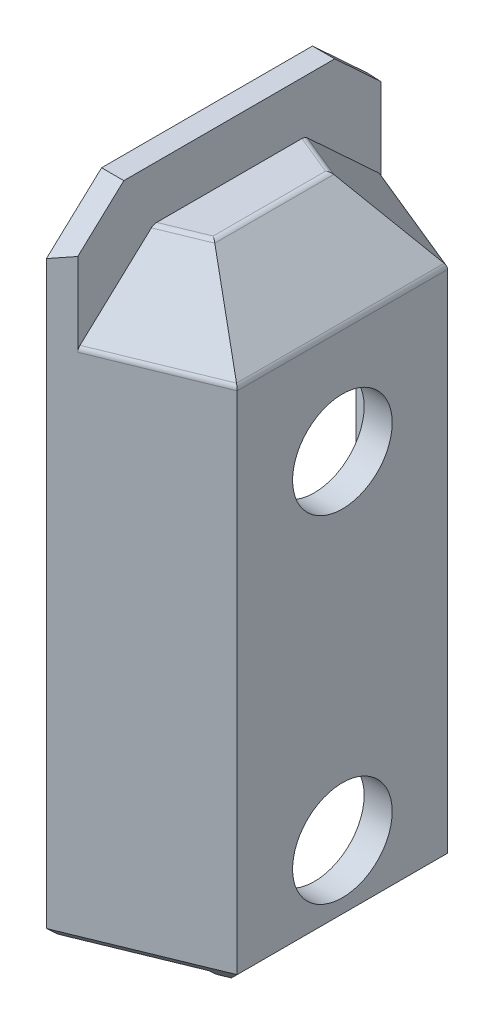
ISO-10303-21;
HEADER;
FILE_DESCRIPTION(('STEP AP214'),'2;1');
FILE_NAME('part.step','',(''),(''),'','','');
FILE_SCHEMA(('AUTOMOTIVE_DESIGN { 1 0 10303 214 1 1 1 1 }'));
ENDSEC;
DATA;
#1=APPLICATION_CONTEXT('core data for automotive mechanical design processes');
#2=APPLICATION_PROTOCOL_DEFINITION('international standard','automotive_design',2000,#1);
#3=PRODUCT_CONTEXT('',#1,'mechanical');
#4=PRODUCT('Part','Part','',(#3));
#5=PRODUCT_RELATED_PRODUCT_CATEGORY('part','',(#4));
#6=PRODUCT_DEFINITION_FORMATION('','',#4);
#7=PRODUCT_DEFINITION_CONTEXT('part definition',#1,'design');
#8=PRODUCT_DEFINITION('design','',#6,#7);
#9=PRODUCT_DEFINITION_SHAPE('','',#8);
#10=(LENGTH_UNIT() NAMED_UNIT(*) SI_UNIT(.MILLI.,.METRE.));
#11=(NAMED_UNIT(*) PLANE_ANGLE_UNIT() SI_UNIT($,.RADIAN.));
#12=(NAMED_UNIT(*) SI_UNIT($,.STERADIAN.) SOLID_ANGLE_UNIT());
#13=UNCERTAINTY_MEASURE_WITH_UNIT(LENGTH_MEASURE(1.E-05),#10,'distance_accuracy_value','');
#14=(GEOMETRIC_REPRESENTATION_CONTEXT(3) GLOBAL_UNCERTAINTY_ASSIGNED_CONTEXT((#13)) GLOBAL_UNIT_ASSIGNED_CONTEXT((#10,
#11,#12)) REPRESENTATION_CONTEXT('',''));
#15=CARTESIAN_POINT('',(0.,0.,0.));
#16=DIRECTION('',(0.,0.,1.));
#17=DIRECTION('',(1.,0.,0.));
#18=AXIS2_PLACEMENT_3D('',#15,#16,#17);
#19=CARTESIAN_POINT('',(3.175,7.5,-19.402609778092));
#20=DIRECTION('',(0.,1.,0.));
#21=DIRECTION('',(0.,0.,1.));
#22=AXIS2_PLACEMENT_3D('',#19,#20,#21);
#23=PLANE('',#22);
#24=DIRECTION('',(0.,0.,1.));
#25=VECTOR('',#24,1.);
#26=CARTESIAN_POINT('',(8.88578643762691,7.5,-19.402609778092));
#27=LINE('',#26,#25);
#28=CARTESIAN_POINT('',(8.88578643762691,7.5,8.01080265694155));
#29=VERTEX_POINT('',#28);
#30=CARTESIAN_POINT('',(8.88578643762691,7.5,-8.01080265694154));
#31=VERTEX_POINT('',#30);
#32=EDGE_CURVE('E309',#29,#31,#27,.F.);
#33=ORIENTED_EDGE('',*,*,#32,.T.);
#34=DIRECTION('',(0.925426676120117,0.,0.378926730549948));
#35=VECTOR('',#34,1.);
#36=CARTESIAN_POINT('',(0.000233412048950173,7.5,-11.6490958291533));
#37=LINE('',#36,#35);
#38=CARTESIAN_POINT('',(3.175,7.5,-10.3491506746921));
#39=VERTEX_POINT('',#38);
#40=EDGE_CURVE('E311',#31,#39,#37,.F.);
#41=ORIENTED_EDGE('',*,*,#40,.T.);
#42=DIRECTION('',(0.,0.,1.));
#43=VECTOR('',#42,1.);
#44=CARTESIAN_POINT('',(3.175,7.5,-19.402609778092));
#45=LINE('',#44,#43);
#46=CARTESIAN_POINT('',(3.175,7.5,10.3491506746921));
#47=VERTEX_POINT('',#46);
#48=EDGE_CURVE('E232',#39,#47,#45,.T.);
#49=ORIENTED_EDGE('',*,*,#48,.T.);
#50=DIRECTION('',(0.925426676120117,0.,-0.378926730549948));
#51=VECTOR('',#50,1.);
#52=CARTESIAN_POINT('',(13.6080172522402,7.5,6.07723025227988));
#53=LINE('',#52,#51);
#54=EDGE_CURVE('E307',#47,#29,#53,.T.);
#55=ORIENTED_EDGE('',*,*,#54,.T.);
#56=EDGE_LOOP('',(#33,#41,#49,#55));
#57=FACE_BOUND('',#56,.T.);
#58=ADVANCED_FACE('F41',(#57),#23,.T.);
#59=CARTESIAN_POINT('',(0.,-2.50000000000004,22.902609778092));
#60=DIRECTION('',(0.267941660744716,0.707106781186546,0.654375478175463));
#61=DIRECTION('',(0.925426676120117,0.,-0.378926730549948));
#62=AXIS2_PLACEMENT_3D('',#59,#60,#61);
#63=PLANE('',#62);
#64=DIRECTION('',(0.,-0.679210724111777,0.733943316783766));
#65=VECTOR('',#64,1.);
#66=CARTESIAN_POINT('',(3.175,-3.14807312601304,22.302865619203));
#67=LINE('',#66,#65);
#68=CARTESIAN_POINT('',(3.175,7.20710678118655,11.1132379864509));
#69=VERTEX_POINT('',#68);
#70=CARTESIAN_POINT('',(3.175,-2.20710678118658,21.2860737229812));
#71=VERTEX_POINT('',#70);
#72=EDGE_CURVE('E237',#69,#71,#67,.T.);
#73=ORIENTED_EDGE('',*,*,#72,.T.);
#74=DIRECTION('',(-0.925426676120117,0.,0.378926730549948));
#75=VECTOR('',#74,1.);
#76=CARTESIAN_POINT('',(19.1890149301948,-2.20710678118658,14.7289488020553));
#77=LINE('',#76,#75);
#78=CARTESIAN_POINT('',(19.0071067811865,-2.20710678118657,14.8034332122661));
#79=VERTEX_POINT('',#78);
#80=EDGE_CURVE('E343',#71,#79,#77,.F.);
#81=ORIENTED_EDGE('',*,*,#80,.T.);
#82=DIRECTION('',(-0.638823976736833,0.638823976736836,-0.428728181360023));
#83=VECTOR('',#82,1.);
#84=CARTESIAN_POINT('',(1.71582840770105,15.084171592299,3.19889330704541));
#85=LINE('',#84,#83);
#86=CARTESIAN_POINT('',(9.59289321881345,7.20710678118655,8.48535686180093));
#87=VERTEX_POINT('',#86);
#88=EDGE_CURVE('E295',#87,#79,#85,.F.);
#89=ORIENTED_EDGE('',*,*,#88,.F.);
#90=DIRECTION('',(0.925426676120117,0.,-0.378926730549948));
#91=VECTOR('',#90,1.);
#92=CARTESIAN_POINT('',(-3.67828223569425,7.20710678118655,13.9193942148355));
#93=LINE('',#92,#91);
#94=EDGE_CURVE('E318',#87,#69,#93,.F.);
#95=ORIENTED_EDGE('',*,*,#94,.T.);
#96=EDGE_LOOP('',(#73,#81,#89,#95));
#97=FACE_BOUND('',#96,.T.);
#98=ADVANCED_FACE('F431',(#97),#63,.T.);
#99=CARTESIAN_POINT('',(0.157190002988433,7.5,-12.0324201093841));
#100=DIRECTION('',(-0.267941660744716,-0.707106781186546,0.654375478175462));
#101=DIRECTION('',(-0.925426676120117,0.,-0.378926730549948));
#102=AXIS2_PLACEMENT_3D('',#99,#100,#101);
#103=PLANE('',#102);
#104=DIRECTION('',(-0.638823976736833,0.638823976736836,0.428728181360024));
#105=VECTOR('',#104,1.);
#106=CARTESIAN_POINT('',(12.3438734094776,4.45612659052238,-10.331597417964));
#107=LINE('',#106,#105);
#108=CARTESIAN_POINT('',(9.59289321881346,7.20710678118655,-8.48535686180092));
#109=VERTEX_POINT('',#108);
#110=CARTESIAN_POINT('',(19.0071067811866,-2.20710678118658,-14.8034332122661));
#111=VERTEX_POINT('',#110);
#112=EDGE_CURVE('E240',#109,#111,#107,.F.);
#113=ORIENTED_EDGE('',*,*,#112,.T.);
#114=DIRECTION('',(0.925426676120117,0.,0.378926730549948));
#115=VECTOR('',#114,1.);
#116=CARTESIAN_POINT('',(3.83547223868268,-2.20710678118659,-21.0156356726406));
#117=LINE('',#116,#115);
#118=CARTESIAN_POINT('',(3.175,-2.20710678118658,-21.2860737229812));
#119=VERTEX_POINT('',#118);
#120=EDGE_CURVE('E334',#111,#119,#117,.F.);
#121=ORIENTED_EDGE('',*,*,#120,.T.);
#122=DIRECTION('',(0.,-0.679210724111777,-0.733943316783766));
#123=VECTOR('',#122,1.);
#124=CARTESIAN_POINT('',(3.175,6.88401210756644,-11.4623684815591));
#125=LINE('',#124,#123);
#126=CARTESIAN_POINT('',(3.175,7.20710678118655,-11.1132379864509));
#127=VERTEX_POINT('',#126);
#128=EDGE_CURVE('E291',#119,#127,#125,.F.);
#129=ORIENTED_EDGE('',*,*,#128,.T.);
#130=DIRECTION('',(-0.925426676120117,0.,-0.378926730549948));
#131=VECTOR('',#130,1.);
#132=CARTESIAN_POINT('',(0.268175072793666,7.20710678118655,-12.3034713073288));
#133=LINE('',#132,#131);
#134=EDGE_CURVE('E314',#127,#109,#133,.F.);
#135=ORIENTED_EDGE('',*,*,#134,.T.);
#136=EDGE_LOOP('',(#113,#121,#129,#135));
#137=FACE_BOUND('',#136,.T.);
#138=ADVANCED_FACE('F439',(#137),#103,.F.);
#139=CARTESIAN_POINT('',(19.3,-2.5,15.));
#140=DIRECTION('',(0.,1.,0.));
#141=DIRECTION('',(0.,0.,1.));
#142=AXIS2_PLACEMENT_3D('',#139,#140,#141);
#143=PLANE('',#142);
#144=DIRECTION('',(0.925426676120117,0.,0.378926730549948));
#145=VECTOR('',#144,1.);
#146=CARTESIAN_POINT('',(13.4053663472503,-2.5,-10.3728666193994));
#147=LINE('',#146,#145);
#148=CARTESIAN_POINT('',(0.,-2.5,-15.8618499963261));
#149=VERTEX_POINT('',#148);
#150=CARTESIAN_POINT('',(10.3,-2.5,-11.6443950370335));
#151=VERTEX_POINT('',#150);
#152=EDGE_CURVE('E276',#149,#151,#147,.T.);
#153=ORIENTED_EDGE('',*,*,#152,.T.);
#154=DIRECTION('',(0.,0.,1.));
#155=VECTOR('',#154,1.);
#156=CARTESIAN_POINT('',(10.3,-2.5,15.));
#157=LINE('',#156,#155);
#158=CARTESIAN_POINT('',(10.3,-2.5,11.6443950370335));
#159=VERTEX_POINT('',#158);
#160=EDGE_CURVE('E274',#151,#159,#157,.T.);
#161=ORIENTED_EDGE('',*,*,#160,.T.);
#162=DIRECTION('',(-0.925426676120117,0.,0.378926730549948));
#163=VECTOR('',#162,1.);
#164=CARTESIAN_POINT('',(-1.89463365274974,-2.5,16.6376298113584));
#165=LINE('',#164,#163);
#166=CARTESIAN_POINT('',(0.,-2.5,15.8618499963261));
#167=VERTEX_POINT('',#166);
#168=EDGE_CURVE('E278',#159,#167,#165,.T.);
#169=ORIENTED_EDGE('',*,*,#168,.T.);
#170=DIRECTION('',(0.,0.,-1.));
#171=VECTOR('',#170,1.);
#172=CARTESIAN_POINT('',(0.,-2.5,15.));
#173=LINE('',#172,#171);
#174=EDGE_CURVE('E264',#167,#149,#173,.T.);
#175=ORIENTED_EDGE('',*,*,#174,.T.);
#176=EDGE_LOOP('',(#153,#161,#169,#175));
#177=FACE_BOUND('',#176,.T.);
#178=ADVANCED_FACE('F406',(#177),#143,.F.);
#179=CARTESIAN_POINT('',(19.3,0.,0.));
#180=DIRECTION('',(1.,0.,0.));
#181=DIRECTION('',(0.,0.,-1.));
#182=AXIS2_PLACEMENT_3D('',#179,#180,#181);
#183=PLANE('',#182);
#184=CARTESIAN_POINT('',(19.3,-17.9000000000868,-2.03531101694576E-06));
#185=DIRECTION('',(1.,0.,0.));
#186=DIRECTION('',(0.,0.,-1.));
#187=AXIS2_PLACEMENT_3D('',#184,#185,#186);
#188=CIRCLE('',#187,7.1);
#189=CARTESIAN_POINT('',(19.3,-17.9000000000868,-7.10000203531102));
#190=VERTEX_POINT('',#189);
#191=EDGE_CURVE('E247',#190,#190,#188,.T.);
#192=ORIENTED_EDGE('',*,*,#191,.F.);
#193=EDGE_LOOP('',(#192));
#194=FACE_BOUND('',#193,.T.);
#195=CARTESIAN_POINT('',(19.3,-65.9000000000868,1.30200223754135E-07));
#196=DIRECTION('',(1.,0.,0.));
#197=DIRECTION('',(0.,0.,-1.));
#198=AXIS2_PLACEMENT_3D('',#195,#196,#197);
#199=CIRCLE('',#198,7.1);
#200=CARTESIAN_POINT('',(19.3,-65.9000000000868,-7.09999986979977));
#201=VERTEX_POINT('',#200);
#202=EDGE_CURVE('E251',#201,#201,#199,.T.);
#203=ORIENTED_EDGE('',*,*,#202,.F.);
#204=EDGE_LOOP('',(#203));
#205=FACE_BOUND('',#204,.T.);
#206=DIRECTION('',(0.,-1.,0.));
#207=VECTOR('',#206,1.);
#208=CARTESIAN_POINT('',(19.3,2.5,15.));
#209=LINE('',#208,#207);
#210=CARTESIAN_POINT('',(19.3,-2.91421356237313,15.));
#211=VERTEX_POINT('',#210);
#212=CARTESIAN_POINT('',(19.3,-75.,15.));
#213=VERTEX_POINT('',#212);
#214=EDGE_CURVE('E265',#211,#213,#209,.T.);
#215=ORIENTED_EDGE('',*,*,#214,.T.);
#216=DIRECTION('',(0.,0.,-1.));
#217=VECTOR('',#216,1.);
#218=CARTESIAN_POINT('',(19.3,-75.,-15.));
#219=LINE('',#218,#217);
#220=CARTESIAN_POINT('',(19.3,-75.,-15.));
#221=VERTEX_POINT('',#220);
#222=EDGE_CURVE('E371',#213,#221,#219,.T.);
#223=ORIENTED_EDGE('',*,*,#222,.T.);
#224=DIRECTION('',(0.,1.,0.));
#225=VECTOR('',#224,1.);
#226=CARTESIAN_POINT('',(19.3,2.5,-15.));
#227=LINE('',#226,#225);
#228=CARTESIAN_POINT('',(19.3,-2.91421356237313,-15.));
#229=VERTEX_POINT('',#228);
#230=EDGE_CURVE('E267',#221,#229,#227,.T.);
#231=ORIENTED_EDGE('',*,*,#230,.T.);
#232=DIRECTION('',(0.,0.,-1.));
#233=VECTOR('',#232,1.);
#234=CARTESIAN_POINT('',(19.3,-2.91421356237313,0.));
#235=LINE('',#234,#233);
#236=EDGE_CURVE('E336',#229,#211,#235,.F.);
#237=ORIENTED_EDGE('',*,*,#236,.T.);
#238=EDGE_LOOP('',(#215,#223,#231,#237));
#239=FACE_BOUND('',#238,.T.);
#240=ADVANCED_FACE('F445',(#194,#205,#239),#183,.T.);
#241=CARTESIAN_POINT('',(0.,0.,0.));
#242=DIRECTION('',(1.,0.,0.));
#243=DIRECTION('',(0.,0.,-1.));
#244=AXIS2_PLACEMENT_3D('',#241,#242,#243);
#245=PLANE('',#244);
#246=DIRECTION('',(0.,1.,0.));
#247=VECTOR('',#246,1.);
#248=CARTESIAN_POINT('',(0.,-23.3552449351427,-22.902609778092));
#249=LINE('',#248,#247);
#250=CARTESIAN_POINT('',(0.,-75.,-22.902609778092));
#251=VERTEX_POINT('',#250);
#252=CARTESIAN_POINT('',(0.,7.71877279687747,-22.902609778092));
#253=VERTEX_POINT('',#252);
#254=EDGE_CURVE('E194',#251,#253,#249,.T.);
#255=ORIENTED_EDGE('',*,*,#254,.F.);
#256=DIRECTION('',(0.,-0.67921072411178,0.733943316783763));
#257=VECTOR('',#256,1.);
#258=CARTESIAN_POINT('',(0.,-75.,-22.902609778092));
#259=LINE('',#258,#257);
#260=CARTESIAN_POINT('',(0.,-76.5157069221998,-21.2647631919589));
#261=VERTEX_POINT('',#260);
#262=EDGE_CURVE('E358',#251,#261,#259,.T.);
#263=ORIENTED_EDGE('',*,*,#262,.T.);
#264=DIRECTION('',(0.,1.,0.));
#265=VECTOR('',#264,1.);
#266=CARTESIAN_POINT('',(0.,-98.3552449351427,-21.2647631919589));
#267=LINE('',#266,#265);
#268=CARTESIAN_POINT('',(0.,-7.50000000000005,-21.2647631919589));
#269=VERTEX_POINT('',#268);
#270=EDGE_CURVE('E241',#261,#269,#267,.T.);
#271=ORIENTED_EDGE('',*,*,#270,.T.);
#272=DIRECTION('',(0.,-0.67921072411178,-0.733943316783763));
#273=VECTOR('',#272,1.);
#274=CARTESIAN_POINT('',(0.,6.5604846889215,-6.07124753940561));
#275=LINE('',#274,#273);
#276=EDGE_CURVE('E289',#269,#149,#275,.F.);
#277=ORIENTED_EDGE('',*,*,#276,.T.);
#278=ORIENTED_EDGE('',*,*,#174,.F.);
#279=DIRECTION('',(0.,0.67921072411178,-0.733943316783763));
#280=VECTOR('',#279,1.);
#281=CARTESIAN_POINT('',(0.,6.5604846889215,6.07124753940561));
#282=LINE('',#281,#280);
#283=CARTESIAN_POINT('',(0.,-7.50000000000005,21.2647631919589));
#284=VERTEX_POINT('',#283);
#285=EDGE_CURVE('E286',#167,#284,#282,.F.);
#286=ORIENTED_EDGE('',*,*,#285,.T.);
#287=DIRECTION('',(0.,1.,0.));
#288=VECTOR('',#287,1.);
#289=CARTESIAN_POINT('',(0.,-98.3552449351427,21.2647631919589));
#290=LINE('',#289,#288);
#291=CARTESIAN_POINT('',(0.,-76.5157069221998,21.2647631919589));
#292=VERTEX_POINT('',#291);
#293=EDGE_CURVE('E243',#292,#284,#290,.T.);
#294=ORIENTED_EDGE('',*,*,#293,.F.);
#295=DIRECTION('',(0.,-0.67921072411178,-0.733943316783763));
#296=VECTOR('',#295,1.);
#297=CARTESIAN_POINT('',(0.,-75.,22.902609778092));
#298=LINE('',#297,#296);
#299=CARTESIAN_POINT('',(0.,-75.,22.902609778092));
#300=VERTEX_POINT('',#299);
#301=EDGE_CURVE('E356',#292,#300,#298,.F.);
#302=ORIENTED_EDGE('',*,*,#301,.T.);
#303=DIRECTION('',(0.,1.,0.));
#304=VECTOR('',#303,1.);
#305=CARTESIAN_POINT('',(0.,-23.3552449351427,22.902609778092));
#306=LINE('',#305,#304);
#307=CARTESIAN_POINT('',(0.,7.71877279687747,22.902609778092));
#308=VERTEX_POINT('',#307);
#309=EDGE_CURVE('E205',#300,#308,#306,.T.);
#310=ORIENTED_EDGE('',*,*,#309,.T.);
#311=DIRECTION('',(0.,0.679210724111777,-0.733943316783766));
#312=VECTOR('',#311,1.);
#313=CARTESIAN_POINT('',(0.,7.71877279687747,22.902609778092));
#314=LINE('',#313,#312);
#315=CARTESIAN_POINT('',(0.,15.,15.0346420708617));
#316=VERTEX_POINT('',#315);
#317=EDGE_CURVE('E226',#308,#316,#314,.T.);
#318=ORIENTED_EDGE('',*,*,#317,.T.);
#319=DIRECTION('',(0.,0.,-1.));
#320=VECTOR('',#319,1.);
#321=CARTESIAN_POINT('',(0.,15.,15.0346420708617));
#322=LINE('',#321,#320);
#323=CARTESIAN_POINT('',(0.,15.,-15.0346420708617));
#324=VERTEX_POINT('',#323);
#325=EDGE_CURVE('E221',#316,#324,#322,.T.);
#326=ORIENTED_EDGE('',*,*,#325,.T.);
#327=DIRECTION('',(0.,-0.679210724111777,-0.733943316783766));
#328=VECTOR('',#327,1.);
#329=CARTESIAN_POINT('',(0.,15.,-15.0346420708617));
#330=LINE('',#329,#328);
#331=EDGE_CURVE('E211',#324,#253,#330,.T.);
#332=ORIENTED_EDGE('',*,*,#331,.T.);
#333=EDGE_LOOP('',(#255,#263,#271,#277,#278,#286,#294,#302,#310,#318,#326,#332));
#334=FACE_BOUND('',#333,.T.);
#335=ADVANCED_FACE('F218',(#334),#245,.F.);
#336=CARTESIAN_POINT('',(15.3,-77.5,15.));
#337=DIRECTION('',(1.,0.,0.));
#338=DIRECTION('',(0.,0.,-1.));
#339=AXIS2_PLACEMENT_3D('',#336,#337,#338);
#340=PLANE('',#339);
#341=CARTESIAN_POINT('',(15.3,-17.9000000000868,-2.03531101694576E-06));
#342=DIRECTION('',(1.,0.,0.));
#343=DIRECTION('',(0.,0.,-1.));
#344=AXIS2_PLACEMENT_3D('',#341,#342,#343);
#345=CIRCLE('',#344,7.1);
#346=CARTESIAN_POINT('',(15.3,-17.9000000000868,-7.10000203531102));
#347=VERTEX_POINT('',#346);
#348=EDGE_CURVE('E250',#347,#347,#345,.F.);
#349=ORIENTED_EDGE('',*,*,#348,.F.);
#350=EDGE_LOOP('',(#349));
#351=FACE_BOUND('',#350,.T.);
#352=CARTESIAN_POINT('',(15.3,-65.9000000000868,1.30200223754135E-07));
#353=DIRECTION('',(1.,0.,0.));
#354=DIRECTION('',(0.,0.,-1.));
#355=AXIS2_PLACEMENT_3D('',#352,#353,#354);
#356=CIRCLE('',#355,7.1);
#357=CARTESIAN_POINT('',(15.3,-65.9000000000868,-7.09999986979977));
#358=VERTEX_POINT('',#357);
#359=EDGE_CURVE('E204',#358,#358,#356,.F.);
#360=ORIENTED_EDGE('',*,*,#359,.F.);
#361=EDGE_LOOP('',(#360));
#362=FACE_BOUND('',#361,.T.);
#363=DIRECTION('',(0.,1.,0.));
#364=VECTOR('',#363,1.);
#365=CARTESIAN_POINT('',(15.3,-77.5,-15.));
#366=LINE('',#365,#364);
#367=CARTESIAN_POINT('',(15.3,-76.5157069221998,-15.));
#368=VERTEX_POINT('',#367);
#369=CARTESIAN_POINT('',(15.3,-7.50000000000005,-15.));
#370=VERTEX_POINT('',#369);
#371=EDGE_CURVE('E260',#368,#370,#366,.T.);
#372=ORIENTED_EDGE('',*,*,#371,.F.);
#373=DIRECTION('',(0.,-0.67921072411178,0.733943316783763));
#374=VECTOR('',#373,1.);
#375=CARTESIAN_POINT('',(15.3,-71.8770019439373,-20.0125040675403));
#376=LINE('',#375,#374);
#377=CARTESIAN_POINT('',(15.3,-77.5,-13.9363899883166));
#378=VERTEX_POINT('',#377);
#379=EDGE_CURVE('E364',#368,#378,#376,.T.);
#380=ORIENTED_EDGE('',*,*,#379,.T.);
#381=DIRECTION('',(0.,0.,-1.));
#382=VECTOR('',#381,1.);
#383=CARTESIAN_POINT('',(15.3,-77.5,15.));
#384=LINE('',#383,#382);
#385=CARTESIAN_POINT('',(15.3,-77.5,13.9363899883166));
#386=VERTEX_POINT('',#385);
#387=EDGE_CURVE('E254',#386,#378,#384,.T.);
#388=ORIENTED_EDGE('',*,*,#387,.F.);
#389=DIRECTION('',(0.,-0.67921072411178,-0.733943316783763));
#390=VECTOR('',#389,1.);
#391=CARTESIAN_POINT('',(15.3,-71.8770019439373,20.0125040675403));
#392=LINE('',#391,#390);
#393=CARTESIAN_POINT('',(15.3,-76.5157069221998,15.));
#394=VERTEX_POINT('',#393);
#395=EDGE_CURVE('E362',#386,#394,#392,.F.);
#396=ORIENTED_EDGE('',*,*,#395,.T.);
#397=DIRECTION('',(0.,1.,0.));
#398=VECTOR('',#397,1.);
#399=CARTESIAN_POINT('',(15.3,-77.5,15.));
#400=LINE('',#399,#398);
#401=CARTESIAN_POINT('',(15.3,-7.50000000000005,15.));
#402=VERTEX_POINT('',#401);
#403=EDGE_CURVE('E262',#394,#402,#400,.T.);
#404=ORIENTED_EDGE('',*,*,#403,.T.);
#405=DIRECTION('',(0.,0.,-1.));
#406=VECTOR('',#405,1.);
#407=CARTESIAN_POINT('',(15.3,-7.50000000000005,-15.));
#408=LINE('',#407,#406);
#409=EDGE_CURVE('E283',#402,#370,#408,.T.);
#410=ORIENTED_EDGE('',*,*,#409,.T.);
#411=EDGE_LOOP('',(#372,#380,#388,#396,#404,#410));
#412=FACE_BOUND('',#411,.T.);
#413=ADVANCED_FACE('F391',(#351,#362,#412),#340,.F.);
#414=CARTESIAN_POINT('',(0.,-77.5,0.));
#415=DIRECTION('',(0.,1.,0.));
#416=DIRECTION('',(0.,0.,1.));
#417=AXIS2_PLACEMENT_3D('',#414,#415,#416);
#418=PLANE('',#417);
#419=ORIENTED_EDGE('',*,*,#387,.T.);
#420=DIRECTION('',(0.925426676120117,0.,0.378926730549948));
#421=VECTOR('',#420,1.);
#422=CARTESIAN_POINT('',(18.3526831736251,-77.5,-12.6864333096997));
#423=LINE('',#422,#421);
#424=CARTESIAN_POINT('',(16.8,-77.5,-13.3221975185167));
#425=VERTEX_POINT('',#424);
#426=EDGE_CURVE('E66',#378,#425,#423,.T.);
#427=ORIENTED_EDGE('',*,*,#426,.T.);
#428=DIRECTION('',(0.,0.,1.));
#429=VECTOR('',#428,1.);
#430=CARTESIAN_POINT('',(16.8,-77.5,15.));
#431=LINE('',#430,#429);
#432=CARTESIAN_POINT('',(16.8,-77.5,13.3221975185167));
#433=VERTEX_POINT('',#432);
#434=EDGE_CURVE('E368',#425,#433,#431,.T.);
#435=ORIENTED_EDGE('',*,*,#434,.T.);
#436=DIRECTION('',(-0.925426676120117,0.,0.378926730549948));
#437=VECTOR('',#436,1.);
#438=CARTESIAN_POINT('',(7.08391626033141,-77.5,17.3005611644165));
#439=LINE('',#438,#437);
#440=EDGE_CURVE('E366',#433,#386,#439,.T.);
#441=ORIENTED_EDGE('',*,*,#440,.T.);
#442=EDGE_LOOP('',(#419,#427,#435,#441));
#443=FACE_BOUND('',#442,.T.);
#444=ADVANCED_FACE('F388',(#443),#418,.F.);
#445=CARTESIAN_POINT('',(-0.001000000000001,-65.9000000000868,1.30200223754135E-07));
#446=DIRECTION('',(1.,0.,0.));
#447=DIRECTION('',(0.,0.,-1.));
#448=AXIS2_PLACEMENT_3D('',#445,#446,#447);
#449=CYLINDRICAL_SURFACE('',#448,7.1);
#450=ORIENTED_EDGE('',*,*,#202,.T.);
#451=EDGE_LOOP('',(#450));
#452=FACE_BOUND('',#451,.T.);
#453=ORIENTED_EDGE('',*,*,#359,.T.);
#454=EDGE_LOOP('',(#453));
#455=FACE_BOUND('',#454,.T.);
#456=ADVANCED_FACE('F753',(#452,#455),#449,.F.);
#457=CARTESIAN_POINT('',(-0.001000000000001,-17.9000000000868,-2.03531101694576E-06));
#458=DIRECTION('',(1.,0.,0.));
#459=DIRECTION('',(0.,0.,-1.));
#460=AXIS2_PLACEMENT_3D('',#457,#458,#459);
#461=CYLINDRICAL_SURFACE('',#460,7.1);
#462=ORIENTED_EDGE('',*,*,#191,.T.);
#463=EDGE_LOOP('',(#462));
#464=FACE_BOUND('',#463,.T.);
#465=ORIENTED_EDGE('',*,*,#348,.T.);
#466=EDGE_LOOP('',(#465));
#467=FACE_BOUND('',#466,.T.);
#468=ADVANCED_FACE('F553',(#464,#467),#461,.F.);
#469=CARTESIAN_POINT('',(0.,-23.3552449351427,-22.902609778092));
#470=DIRECTION('',(0.378926730549948,0.,-0.925426676120117));
#471=DIRECTION('',(-0.925426676120117,0.,-0.378926730549948));
#472=AXIS2_PLACEMENT_3D('',#469,#470,#471);
#473=PLANE('',#472);
#474=ORIENTED_EDGE('',*,*,#230,.F.);
#475=DIRECTION('',(-0.925426676120117,0.,-0.378926730549948));
#476=VECTOR('',#475,1.);
#477=CARTESIAN_POINT('',(0.,-75.,-22.902609778092));
#478=LINE('',#477,#476);
#479=EDGE_CURVE('E201',#221,#251,#478,.T.);
#480=ORIENTED_EDGE('',*,*,#479,.T.);
#481=ORIENTED_EDGE('',*,*,#254,.T.);
#482=DIRECTION('',(0.873289406927855,0.330912699791077,0.357578518460737));
#483=VECTOR('',#482,1.);
#484=CARTESIAN_POINT('',(6.98243842213033,10.3646053594417,-20.0435690449494));
#485=LINE('',#484,#483);
#486=CARTESIAN_POINT('',(3.175,8.92186516637356,-21.6025690503489));
#487=VERTEX_POINT('',#486);
#488=EDGE_CURVE('E198',#253,#487,#485,.T.);
#489=ORIENTED_EDGE('',*,*,#488,.T.);
#490=DIRECTION('',(0.,1.,0.));
#491=VECTOR('',#490,1.);
#492=CARTESIAN_POINT('',(3.175,0.,-21.6025690503489));
#493=LINE('',#492,#491);
#494=CARTESIAN_POINT('',(3.175,-2.91421356237313,-21.6025690503489));
#495=VERTEX_POINT('',#494);
#496=EDGE_CURVE('E303',#495,#487,#493,.T.);
#497=ORIENTED_EDGE('',*,*,#496,.F.);
#498=DIRECTION('',(-0.925426676120117,0.,-0.378926730549948));
#499=VECTOR('',#498,1.);
#500=CARTESIAN_POINT('',(0.,-2.91421356237313,-22.902609778092));
#501=LINE('',#500,#499);
#502=EDGE_CURVE('E325',#495,#229,#501,.F.);
#503=ORIENTED_EDGE('',*,*,#502,.T.);
#504=EDGE_LOOP('',(#474,#480,#481,#489,#497,#503));
#505=FACE_BOUND('',#504,.T.);
#506=ADVANCED_FACE('F197',(#505),#473,.T.);
#507=CARTESIAN_POINT('',(0.,-23.3552449351427,22.902609778092));
#508=DIRECTION('',(-0.378926730549948,0.,-0.925426676120117));
#509=DIRECTION('',(-0.925426676120117,0.,0.378926730549948));
#510=AXIS2_PLACEMENT_3D('',#507,#508,#509);
#511=PLANE('',#510);
#512=ORIENTED_EDGE('',*,*,#309,.F.);
#513=DIRECTION('',(0.925426676120117,0.,-0.378926730549948));
#514=VECTOR('',#513,1.);
#515=CARTESIAN_POINT('',(0.,-75.,22.902609778092));
#516=LINE('',#515,#514);
#517=EDGE_CURVE('E51',#300,#213,#516,.T.);
#518=ORIENTED_EDGE('',*,*,#517,.T.);
#519=ORIENTED_EDGE('',*,*,#214,.F.);
#520=DIRECTION('',(-0.925426676120117,0.,0.378926730549948));
#521=VECTOR('',#520,1.);
#522=CARTESIAN_POINT('',(3.175,-2.91421356237313,21.6025690503489));
#523=LINE('',#522,#521);
#524=CARTESIAN_POINT('',(3.175,-2.91421356237313,21.6025690503489));
#525=VERTEX_POINT('',#524);
#526=EDGE_CURVE('E340',#211,#525,#523,.T.);
#527=ORIENTED_EDGE('',*,*,#526,.T.);
#528=DIRECTION('',(0.,-1.,0.));
#529=VECTOR('',#528,1.);
#530=CARTESIAN_POINT('',(3.175,0.,21.6025690503489));
#531=LINE('',#530,#529);
#532=CARTESIAN_POINT('',(3.175,8.92186516637355,21.6025690503489));
#533=VERTEX_POINT('',#532);
#534=EDGE_CURVE('E305',#533,#525,#531,.T.);
#535=ORIENTED_EDGE('',*,*,#534,.F.);
#536=DIRECTION('',(-0.873289406927857,-0.330912699791075,0.357578518460735));
#537=VECTOR('',#536,1.);
#538=CARTESIAN_POINT('',(2.4213641827014,8.63629241009925,21.9111540129864));
#539=LINE('',#538,#537);
#540=EDGE_CURVE('E215',#533,#308,#539,.T.);
#541=ORIENTED_EDGE('',*,*,#540,.T.);
#542=EDGE_LOOP('',(#512,#518,#519,#527,#535,#541));
#543=FACE_BOUND('',#542,.T.);
#544=ADVANCED_FACE('F422',(#543),#511,.F.);
#545=CARTESIAN_POINT('',(15.3,-98.3552449351427,15.));
#546=DIRECTION('',(0.378926730549948,0.,0.925426676120117));
#547=DIRECTION('',(0.925426676120117,0.,-0.378926730549948));
#548=AXIS2_PLACEMENT_3D('',#545,#546,#547);
#549=PLANE('',#548);
#550=ORIENTED_EDGE('',*,*,#403,.F.);
#551=DIRECTION('',(0.925426676120117,0.,-0.378926730549948));
#552=VECTOR('',#551,1.);
#553=CARTESIAN_POINT('',(-0.574341868501091,-76.5157069221998,21.4999341591084));
#554=LINE('',#553,#552);
#555=EDGE_CURVE('E11',#394,#292,#554,.F.);
#556=ORIENTED_EDGE('',*,*,#555,.T.);
#557=ORIENTED_EDGE('',*,*,#293,.T.);
#558=DIRECTION('',(0.925426676120117,0.,-0.378926730549948));
#559=VECTOR('',#558,1.);
#560=CARTESIAN_POINT('',(15.3,-7.50000000000005,15.));
#561=LINE('',#560,#559);
#562=EDGE_CURVE('E269',#284,#402,#561,.T.);
#563=ORIENTED_EDGE('',*,*,#562,.T.);
#564=EDGE_LOOP('',(#550,#556,#557,#563));
#565=FACE_BOUND('',#564,.T.);
#566=ADVANCED_FACE('F420',(#565),#549,.F.);
#567=CARTESIAN_POINT('',(15.3,-98.3552449351427,-15.));
#568=DIRECTION('',(0.378926730549948,0.,-0.925426676120117));
#569=DIRECTION('',(-0.925426676120117,0.,-0.378926730549948));
#570=AXIS2_PLACEMENT_3D('',#567,#568,#569);
#571=PLANE('',#570);
#572=ORIENTED_EDGE('',*,*,#270,.F.);
#573=DIRECTION('',(0.925426676120117,0.,0.378926730549948));
#574=VECTOR('',#573,1.);
#575=CARTESIAN_POINT('',(-0.574341868501091,-76.5157069221998,-21.4999341591084));
#576=LINE('',#575,#574);
#577=EDGE_CURVE('E360',#261,#368,#576,.T.);
#578=ORIENTED_EDGE('',*,*,#577,.T.);
#579=ORIENTED_EDGE('',*,*,#371,.T.);
#580=DIRECTION('',(-0.925426676120117,0.,-0.378926730549948));
#581=VECTOR('',#580,1.);
#582=CARTESIAN_POINT('',(0.,-7.50000000000005,-21.2647631919589));
#583=LINE('',#582,#581);
#584=EDGE_CURVE('E280',#370,#269,#583,.T.);
#585=ORIENTED_EDGE('',*,*,#584,.T.);
#586=EDGE_LOOP('',(#572,#578,#579,#585));
#587=FACE_BOUND('',#586,.T.);
#588=ADVANCED_FACE('F398',(#587),#571,.F.);
#589=CARTESIAN_POINT('',(15.3,-7.50000000000005,-15.));
#590=DIRECTION('',(-0.267941660744717,-0.707106781186543,0.654375478175465));
#591=DIRECTION('',(0.925426676120117,0.,0.378926730549948));
#592=AXIS2_PLACEMENT_3D('',#589,#590,#591);
#593=PLANE('',#592);
#594=ORIENTED_EDGE('',*,*,#276,.F.);
#595=ORIENTED_EDGE('',*,*,#584,.F.);
#596=DIRECTION('',(0.638823976736831,-0.638823976736838,-0.428728181360022));
#597=VECTOR('',#596,1.);
#598=CARTESIAN_POINT('',(15.3,-7.50000000000005,-15.));
#599=LINE('',#598,#597);
#600=EDGE_CURVE('E245',#151,#370,#599,.T.);
#601=ORIENTED_EDGE('',*,*,#600,.F.);
#602=ORIENTED_EDGE('',*,*,#152,.F.);
#603=EDGE_LOOP('',(#594,#595,#601,#602));
#604=FACE_BOUND('',#603,.T.);
#605=ADVANCED_FACE('F409',(#604),#593,.T.);
#606=CARTESIAN_POINT('',(15.3,-7.50000000000005,15.));
#607=DIRECTION('',(-0.707106781186551,-0.707106781186543,0.));
#608=DIRECTION('',(0.,0.,1.));
#609=AXIS2_PLACEMENT_3D('',#606,#607,#608);
#610=PLANE('',#609);
#611=ORIENTED_EDGE('',*,*,#600,.T.);
#612=ORIENTED_EDGE('',*,*,#409,.F.);
#613=DIRECTION('',(-0.638823976736831,0.638823976736838,-0.428728181360022));
#614=VECTOR('',#613,1.);
#615=CARTESIAN_POINT('',(15.3,-7.50000000000005,15.));
#616=LINE('',#615,#614);
#617=EDGE_CURVE('E292',#159,#402,#616,.F.);
#618=ORIENTED_EDGE('',*,*,#617,.F.);
#619=ORIENTED_EDGE('',*,*,#160,.F.);
#620=EDGE_LOOP('',(#611,#612,#618,#619));
#621=FACE_BOUND('',#620,.T.);
#622=ADVANCED_FACE('F414',(#621),#610,.T.);
#623=CARTESIAN_POINT('',(15.3,-7.50000000000005,15.));
#624=DIRECTION('',(-0.267941660744717,-0.707106781186543,-0.654375478175465));
#625=DIRECTION('',(-0.925426676120117,0.,0.378926730549948));
#626=AXIS2_PLACEMENT_3D('',#623,#624,#625);
#627=PLANE('',#626);
#628=ORIENTED_EDGE('',*,*,#285,.F.);
#629=ORIENTED_EDGE('',*,*,#168,.F.);
#630=ORIENTED_EDGE('',*,*,#617,.T.);
#631=ORIENTED_EDGE('',*,*,#562,.F.);
#632=EDGE_LOOP('',(#628,#629,#630,#631));
#633=FACE_BOUND('',#632,.T.);
#634=ADVANCED_FACE('F416',(#633),#627,.T.);
#635=CARTESIAN_POINT('',(9.30000000000001,7.5,-19.402609778092));
#636=DIRECTION('',(-0.707106781186549,-0.707106781186546,0.));
#637=DIRECTION('',(0.,0.,-1.));
#638=AXIS2_PLACEMENT_3D('',#635,#636,#637);
#639=PLANE('',#638);
#640=ORIENTED_EDGE('',*,*,#88,.T.);
#641=DIRECTION('',(0.,0.,1.));
#642=VECTOR('',#641,1.);
#643=CARTESIAN_POINT('',(19.0071067811866,-2.20710678118658,-19.402609778092));
#644=LINE('',#643,#642);
#645=EDGE_CURVE('E338',#79,#111,#644,.F.);
#646=ORIENTED_EDGE('',*,*,#645,.T.);
#647=ORIENTED_EDGE('',*,*,#112,.F.);
#648=DIRECTION('',(0.,0.,-1.));
#649=VECTOR('',#648,1.);
#650=CARTESIAN_POINT('',(9.59289321881346,7.20710678118655,-19.402609778092));
#651=LINE('',#650,#649);
#652=EDGE_CURVE('E316',#109,#87,#651,.F.);
#653=ORIENTED_EDGE('',*,*,#652,.T.);
#654=EDGE_LOOP('',(#640,#646,#647,#653));
#655=FACE_BOUND('',#654,.T.);
#656=ADVANCED_FACE('F460',(#655),#639,.F.);
#657=CARTESIAN_POINT('',(3.175,15.,-15.0346420708617));
#658=DIRECTION('',(0.,0.733943316783766,-0.679210724111777));
#659=DIRECTION('',(0.,0.679210724111777,0.733943316783766));
#660=AXIS2_PLACEMENT_3D('',#657,#658,#659);
#661=PLANE('',#660);
#662=ORIENTED_EDGE('',*,*,#488,.F.);
#663=ORIENTED_EDGE('',*,*,#331,.F.);
#664=DIRECTION('',(-1.,0.,0.));
#665=VECTOR('',#664,1.);
#666=CARTESIAN_POINT('',(3.175,15.,-15.0346420708617));
#667=LINE('',#666,#665);
#668=CARTESIAN_POINT('',(3.175,15.,-15.0346420708617));
#669=VERTEX_POINT('',#668);
#670=EDGE_CURVE('E230',#669,#324,#667,.T.);
#671=ORIENTED_EDGE('',*,*,#670,.F.);
#672=DIRECTION('',(0.,-0.679210724111777,-0.733943316783766));
#673=VECTOR('',#672,1.);
#674=CARTESIAN_POINT('',(3.175,15.,-15.0346420708617));
#675=LINE('',#674,#673);
#676=EDGE_CURVE('E214',#669,#487,#675,.T.);
#677=ORIENTED_EDGE('',*,*,#676,.T.);
#678=EDGE_LOOP('',(#662,#663,#671,#677));
#679=FACE_BOUND('',#678,.T.);
#680=ADVANCED_FACE('F210',(#679),#661,.T.);
#681=CARTESIAN_POINT('',(3.175,15.,15.0346420708617));
#682=DIRECTION('',(0.,1.,0.));
#683=DIRECTION('',(0.,0.,1.));
#684=AXIS2_PLACEMENT_3D('',#681,#682,#683);
#685=PLANE('',#684);
#686=ORIENTED_EDGE('',*,*,#325,.F.);
#687=DIRECTION('',(-1.,0.,0.));
#688=VECTOR('',#687,1.);
#689=CARTESIAN_POINT('',(3.175,15.,15.0346420708617));
#690=LINE('',#689,#688);
#691=CARTESIAN_POINT('',(3.175,15.,15.0346420708617));
#692=VERTEX_POINT('',#691);
#693=EDGE_CURVE('E233',#692,#316,#690,.T.);
#694=ORIENTED_EDGE('',*,*,#693,.F.);
#695=DIRECTION('',(0.,0.,-1.));
#696=VECTOR('',#695,1.);
#697=CARTESIAN_POINT('',(3.175,15.,15.0346420708617));
#698=LINE('',#697,#696);
#699=EDGE_CURVE('E224',#692,#669,#698,.T.);
#700=ORIENTED_EDGE('',*,*,#699,.T.);
#701=ORIENTED_EDGE('',*,*,#670,.T.);
#702=EDGE_LOOP('',(#686,#694,#700,#701));
#703=FACE_BOUND('',#702,.T.);
#704=ADVANCED_FACE('F636',(#703),#685,.T.);
#705=CARTESIAN_POINT('',(3.175,7.71877279687747,22.902609778092));
#706=DIRECTION('',(0.,0.733943316783766,0.679210724111777));
#707=DIRECTION('',(0.,-0.679210724111777,0.733943316783766));
#708=AXIS2_PLACEMENT_3D('',#705,#706,#707);
#709=PLANE('',#708);
#710=ORIENTED_EDGE('',*,*,#540,.F.);
#711=DIRECTION('',(0.,0.679210724111777,-0.733943316783766));
#712=VECTOR('',#711,1.);
#713=CARTESIAN_POINT('',(3.175,7.71877279687747,22.902609778092));
#714=LINE('',#713,#712);
#715=EDGE_CURVE('E222',#533,#692,#714,.T.);
#716=ORIENTED_EDGE('',*,*,#715,.T.);
#717=ORIENTED_EDGE('',*,*,#693,.T.);
#718=ORIENTED_EDGE('',*,*,#317,.F.);
#719=EDGE_LOOP('',(#710,#716,#717,#718));
#720=FACE_BOUND('',#719,.T.);
#721=ADVANCED_FACE('F644',(#720),#709,.T.);
#722=CARTESIAN_POINT('',(3.175,0.,0.));
#723=DIRECTION('',(-1.,0.,0.));
#724=DIRECTION('',(0.,0.,1.));
#725=AXIS2_PLACEMENT_3D('',#722,#723,#724);
#726=PLANE('',#725);
#727=ORIENTED_EDGE('',*,*,#715,.F.);
#728=ORIENTED_EDGE('',*,*,#534,.T.);
#729=CARTESIAN_POINT('',(3.175,-2.91421356237313,20.5219864112223));
#730=DIRECTION('',(-1.,0.,0.));
#731=DIRECTION('',(0.,0.,-1.));
#732=AXIS2_PLACEMENT_3D('',#729,#730,#731);
#733=ELLIPSE('',#732,1.08058263912656,1.);
#734=EDGE_CURVE('E348',#525,#71,#733,.T.);
#735=ORIENTED_EDGE('',*,*,#734,.T.);
#736=ORIENTED_EDGE('',*,*,#72,.F.);
#737=CARTESIAN_POINT('',(3.175,6.5,10.3491506746921));
#738=DIRECTION('',(-1.,0.,0.));
#739=DIRECTION('',(0.,0.,-1.));
#740=AXIS2_PLACEMENT_3D('',#737,#738,#739);
#741=ELLIPSE('',#740,1.08058263912656,1.);
#742=EDGE_CURVE('E323',#69,#47,#741,.T.);
#743=ORIENTED_EDGE('',*,*,#742,.T.);
#744=ORIENTED_EDGE('',*,*,#48,.F.);
#745=CARTESIAN_POINT('',(3.175,6.5,-10.3491506746921));
#746=DIRECTION('',(-1.,0.,0.));
#747=DIRECTION('',(0.,0.,1.));
#748=AXIS2_PLACEMENT_3D('',#745,#746,#747);
#749=ELLIPSE('',#748,1.08058263912656,1.);
#750=EDGE_CURVE('E320',#39,#127,#749,.T.);
#751=ORIENTED_EDGE('',*,*,#750,.T.);
#752=ORIENTED_EDGE('',*,*,#128,.F.);
#753=CARTESIAN_POINT('',(3.175,-2.91421356237313,-20.5219864112223));
#754=DIRECTION('',(-1.,0.,0.));
#755=DIRECTION('',(0.,0.,-1.));
#756=AXIS2_PLACEMENT_3D('',#753,#754,#755);
#757=ELLIPSE('',#756,1.08058263912656,1.);
#758=EDGE_CURVE('E345',#119,#495,#757,.T.);
#759=ORIENTED_EDGE('',*,*,#758,.T.);
#760=ORIENTED_EDGE('',*,*,#496,.T.);
#761=ORIENTED_EDGE('',*,*,#676,.F.);
#762=ORIENTED_EDGE('',*,*,#699,.F.);
#763=EDGE_LOOP('',(#727,#728,#735,#736,#743,#744,#751,#752,#759,#760,#761,#762));
#764=FACE_BOUND('',#763,.T.);
#765=ADVANCED_FACE('F495',(#764),#726,.F.);
#766=CARTESIAN_POINT('',(13.6080172522402,6.5,6.07723025227987));
#767=DIRECTION('',(0.925426676120117,0.,-0.378926730549948));
#768=DIRECTION('',(-0.378926730549948,0.,-0.925426676120117));
#769=AXIS2_PLACEMENT_3D('',#766,#767,#768);
#770=CYLINDRICAL_SURFACE('',#769,1.);
#771=ORIENTED_EDGE('',*,*,#742,.F.);
#772=ORIENTED_EDGE('',*,*,#94,.F.);
#773=CARTESIAN_POINT('',(8.88578643762691,6.5,8.01080265694155));
#774=DIRECTION('',(0.557258140115536,0.,-0.830339307316578));
#775=DIRECTION('',(0.830339307316578,0.,0.557258140115536));
#776=AXIS2_PLACEMENT_3D('',#773,#774,#775);
#777=ELLIPSE('',#776,1.20432694344161,1.);
#778=EDGE_CURVE('E216',#29,#87,#777,.T.);
#779=ORIENTED_EDGE('',*,*,#778,.F.);
#780=ORIENTED_EDGE('',*,*,#54,.F.);
#781=EDGE_LOOP('',(#771,#772,#779,#780));
#782=FACE_BOUND('',#781,.T.);
#783=ADVANCED_FACE('F492',(#782),#770,.T.);
#784=CARTESIAN_POINT('',(8.88578643762691,6.5,-19.402609778092));
#785=DIRECTION('',(0.,0.,1.));
#786=DIRECTION('',(1.,0.,0.));
#787=AXIS2_PLACEMENT_3D('',#784,#785,#786);
#788=CYLINDRICAL_SURFACE('',#787,1.);
#789=ORIENTED_EDGE('',*,*,#778,.T.);
#790=ORIENTED_EDGE('',*,*,#652,.F.);
#791=CARTESIAN_POINT('',(8.88578643762691,6.5,-8.01080265694154));
#792=DIRECTION('',(0.557258140115536,0.,0.830339307316578));
#793=DIRECTION('',(-0.830339307316578,0.,0.557258140115536));
#794=AXIS2_PLACEMENT_3D('',#791,#792,#793);
#795=ELLIPSE('',#794,1.20432694344161,1.);
#796=EDGE_CURVE('E326',#31,#109,#795,.F.);
#797=ORIENTED_EDGE('',*,*,#796,.F.);
#798=ORIENTED_EDGE('',*,*,#32,.F.);
#799=EDGE_LOOP('',(#789,#790,#797,#798));
#800=FACE_BOUND('',#799,.T.);
#801=ADVANCED_FACE('F488',(#800),#788,.T.);
#802=CARTESIAN_POINT('',(0.000233412048950173,6.5,-11.6490958291533));
#803=DIRECTION('',(0.925426676120117,0.,0.378926730549948));
#804=DIRECTION('',(0.378926730549948,0.,-0.925426676120117));
#805=AXIS2_PLACEMENT_3D('',#802,#803,#804);
#806=CYLINDRICAL_SURFACE('',#805,1.);
#807=ORIENTED_EDGE('',*,*,#796,.T.);
#808=ORIENTED_EDGE('',*,*,#134,.F.);
#809=ORIENTED_EDGE('',*,*,#750,.F.);
#810=ORIENTED_EDGE('',*,*,#40,.F.);
#811=EDGE_LOOP('',(#807,#808,#809,#810));
#812=FACE_BOUND('',#811,.T.);
#813=ADVANCED_FACE('F484',(#812),#806,.T.);
#814=CARTESIAN_POINT('',(-0.378926730549949,-2.91421356237313,21.9771831019719));
#815=DIRECTION('',(0.925426676120117,0.,-0.378926730549948));
#816=DIRECTION('',(-0.378926730549948,0.,-0.925426676120117));
#817=AXIS2_PLACEMENT_3D('',#814,#815,#816);
#818=CYLINDRICAL_SURFACE('',#817,1.);
#819=ORIENTED_EDGE('',*,*,#734,.F.);
#820=ORIENTED_EDGE('',*,*,#526,.F.);
#821=CARTESIAN_POINT('',(18.3,-2.91421356237313,14.3288790074067));
#822=DIRECTION('',(0.557258140115536,0.,-0.830339307316578));
#823=DIRECTION('',(0.830339307316578,0.,0.557258140115536));
#824=AXIS2_PLACEMENT_3D('',#821,#822,#823);
#825=ELLIPSE('',#824,1.20432694344161,1.);
#826=EDGE_CURVE('E329',#79,#211,#825,.T.);
#827=ORIENTED_EDGE('',*,*,#826,.F.);
#828=ORIENTED_EDGE('',*,*,#80,.F.);
#829=EDGE_LOOP('',(#819,#820,#827,#828));
#830=FACE_BOUND('',#829,.T.);
#831=ADVANCED_FACE('F487',(#830),#818,.T.);
#832=CARTESIAN_POINT('',(18.3,-2.91421356237313,0.));
#833=DIRECTION('',(0.,0.,-1.));
#834=DIRECTION('',(-1.,0.,0.));
#835=AXIS2_PLACEMENT_3D('',#832,#833,#834);
#836=CYLINDRICAL_SURFACE('',#835,1.);
#837=ORIENTED_EDGE('',*,*,#826,.T.);
#838=ORIENTED_EDGE('',*,*,#236,.F.);
#839=CARTESIAN_POINT('',(18.3,-2.91421356237313,-14.3288790074067));
#840=DIRECTION('',(-0.557258140115536,0.,-0.830339307316578));
#841=DIRECTION('',(0.830339307316578,0.,-0.557258140115536));
#842=AXIS2_PLACEMENT_3D('',#839,#840,#841);
#843=ELLIPSE('',#842,1.20432694344161,1.);
#844=EDGE_CURVE('E350',#111,#229,#843,.T.);
#845=ORIENTED_EDGE('',*,*,#844,.F.);
#846=ORIENTED_EDGE('',*,*,#645,.F.);
#847=EDGE_LOOP('',(#837,#838,#845,#846));
#848=FACE_BOUND('',#847,.T.);
#849=ADVANCED_FACE('F500',(#848),#836,.T.);
#850=CARTESIAN_POINT('',(-0.378926730549949,-2.91421356237313,-21.9771831019719));
#851=DIRECTION('',(-0.925426676120117,0.,-0.378926730549948));
#852=DIRECTION('',(-0.378926730549948,0.,0.925426676120117));
#853=AXIS2_PLACEMENT_3D('',#850,#851,#852);
#854=CYLINDRICAL_SURFACE('',#853,1.);
#855=ORIENTED_EDGE('',*,*,#758,.F.);
#856=ORIENTED_EDGE('',*,*,#120,.F.);
#857=ORIENTED_EDGE('',*,*,#844,.T.);
#858=ORIENTED_EDGE('',*,*,#502,.F.);
#859=EDGE_LOOP('',(#855,#856,#857,#858));
#860=FACE_BOUND('',#859,.T.);
#861=ADVANCED_FACE('F497',(#860),#854,.T.);
#862=CARTESIAN_POINT('',(0.,-75.,22.902609778092));
#863=DIRECTION('',(-0.267941660744717,0.707106781186544,-0.654375478175465));
#864=DIRECTION('',(0.925426676120117,0.,-0.378926730549948));
#865=AXIS2_PLACEMENT_3D('',#862,#863,#864);
#866=PLANE('',#865);
#867=ORIENTED_EDGE('',*,*,#395,.F.);
#868=ORIENTED_EDGE('',*,*,#440,.F.);
#869=DIRECTION('',(-0.638823976736832,-0.638823976736838,-0.428728181360022));
#870=VECTOR('',#869,1.);
#871=CARTESIAN_POINT('',(13.5881271068998,-80.7118728931002,11.1666421944158));
#872=LINE('',#871,#870);
#873=EDGE_CURVE('E46',#213,#433,#872,.T.);
#874=ORIENTED_EDGE('',*,*,#873,.F.);
#875=ORIENTED_EDGE('',*,*,#517,.F.);
#876=ORIENTED_EDGE('',*,*,#301,.F.);
#877=ORIENTED_EDGE('',*,*,#555,.F.);
#878=EDGE_LOOP('',(#867,#868,#874,#875,#876,#877));
#879=FACE_BOUND('',#878,.T.);
#880=ADVANCED_FACE('F44',(#879),#866,.F.);
#881=CARTESIAN_POINT('',(16.8,-77.5,0.));
#882=DIRECTION('',(0.707106781186551,-0.707106781186544,0.));
#883=DIRECTION('',(0.,0.,-1.));
#884=AXIS2_PLACEMENT_3D('',#881,#882,#883);
#885=PLANE('',#884);
#886=ORIENTED_EDGE('',*,*,#873,.T.);
#887=ORIENTED_EDGE('',*,*,#434,.F.);
#888=DIRECTION('',(0.638823976736832,0.638823976736838,-0.428728181360022));
#889=VECTOR('',#888,1.);
#890=CARTESIAN_POINT('',(13.1512920073973,-81.1487079926027,-10.8734729888381));
#891=LINE('',#890,#889);
#892=EDGE_CURVE('E373',#221,#425,#891,.F.);
#893=ORIENTED_EDGE('',*,*,#892,.F.);
#894=ORIENTED_EDGE('',*,*,#222,.F.);
#895=EDGE_LOOP('',(#886,#887,#893,#894));
#896=FACE_BOUND('',#895,.T.);
#897=ADVANCED_FACE('F381',(#896),#885,.T.);
#898=CARTESIAN_POINT('',(0.,-75.,-22.902609778092));
#899=DIRECTION('',(0.267941660744717,-0.707106781186544,-0.654375478175465));
#900=DIRECTION('',(0.925426676120117,0.,0.378926730549948));
#901=AXIS2_PLACEMENT_3D('',#898,#899,#900);
#902=PLANE('',#901);
#903=ORIENTED_EDGE('',*,*,#892,.T.);
#904=ORIENTED_EDGE('',*,*,#426,.F.);
#905=ORIENTED_EDGE('',*,*,#379,.F.);
#906=ORIENTED_EDGE('',*,*,#577,.F.);
#907=ORIENTED_EDGE('',*,*,#262,.F.);
#908=ORIENTED_EDGE('',*,*,#479,.F.);
#909=EDGE_LOOP('',(#903,#904,#905,#906,#907,#908));
#910=FACE_BOUND('',#909,.T.);
#911=ADVANCED_FACE('F395',(#910),#902,.T.);
#912=CLOSED_SHELL('',(#58,#98,#138,#178,#240,#335,#413,#444,#456,#468,#506,#544,#566,#588,#605,
#622,#634,#656,#680,#704,#721,#765,#783,#801,#813,#831,#849,#861,#880,#897,#911));
#913=MANIFOLD_SOLID_BREP('B2',#912);
#914=ADVANCED_BREP_SHAPE_REPRESENTATION('',(#18,#913),#14);
#915=SHAPE_DEFINITION_REPRESENTATION(#9,#914);
ENDSEC;
END-ISO-10303-21;
